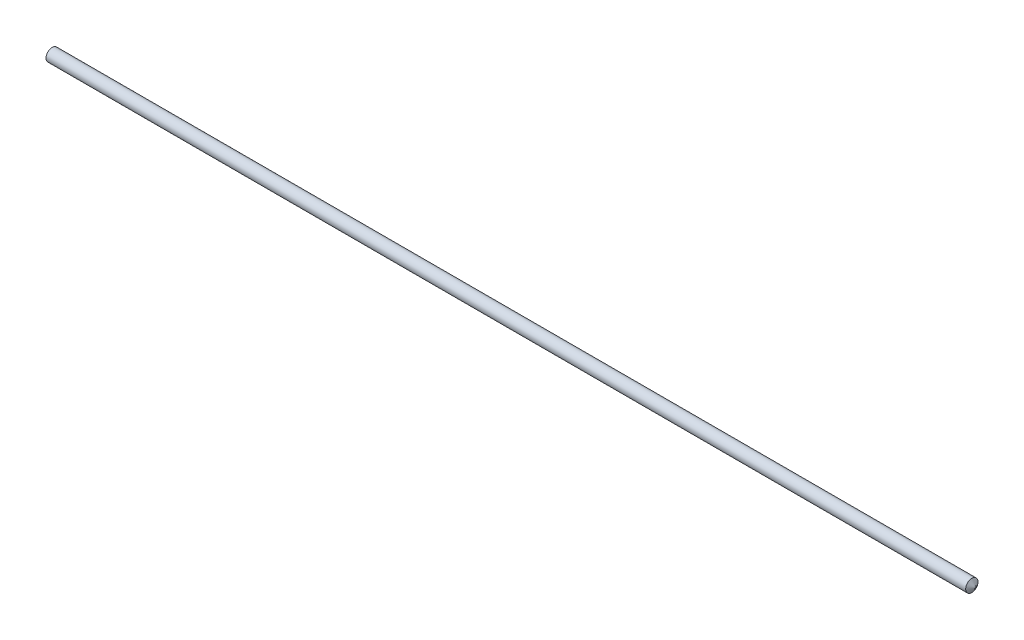
ISO-10303-21;
HEADER;
FILE_DESCRIPTION(('STEP AP214'),'2;1');
FILE_NAME('part.step','',(''),(''),'','','');
FILE_SCHEMA(('AUTOMOTIVE_DESIGN { 1 0 10303 214 1 1 1 1 }'));
ENDSEC;
DATA;
#1=APPLICATION_CONTEXT('core data for automotive mechanical design processes');
#2=APPLICATION_PROTOCOL_DEFINITION('international standard','automotive_design',2000,#1);
#3=PRODUCT_CONTEXT('',#1,'mechanical');
#4=PRODUCT('Part','Part','',(#3));
#5=PRODUCT_RELATED_PRODUCT_CATEGORY('part','',(#4));
#6=PRODUCT_DEFINITION_FORMATION('','',#4);
#7=PRODUCT_DEFINITION_CONTEXT('part definition',#1,'design');
#8=PRODUCT_DEFINITION('design','',#6,#7);
#9=PRODUCT_DEFINITION_SHAPE('','',#8);
#10=(LENGTH_UNIT() NAMED_UNIT(*) SI_UNIT(.MILLI.,.METRE.));
#11=(NAMED_UNIT(*) PLANE_ANGLE_UNIT() SI_UNIT($,.RADIAN.));
#12=(NAMED_UNIT(*) SI_UNIT($,.STERADIAN.) SOLID_ANGLE_UNIT());
#13=UNCERTAINTY_MEASURE_WITH_UNIT(LENGTH_MEASURE(1.E-05),#10,'distance_accuracy_value','');
#14=(GEOMETRIC_REPRESENTATION_CONTEXT(3) GLOBAL_UNCERTAINTY_ASSIGNED_CONTEXT((#13)) GLOBAL_UNIT_ASSIGNED_CONTEXT((#10,
#11,#12)) REPRESENTATION_CONTEXT('',''));
#15=CARTESIAN_POINT('',(0.,0.,0.));
#16=DIRECTION('',(0.,0.,1.));
#17=DIRECTION('',(1.,0.,0.));
#18=AXIS2_PLACEMENT_3D('',#15,#16,#17);
#19=CARTESIAN_POINT('',(0.600860619027557,0.,0.));
#20=DIRECTION('',(1.,0.,0.));
#21=DIRECTION('',(0.,0.,-1.));
#22=AXIS2_PLACEMENT_3D('',#19,#20,#21);
#23=CONICAL_SURFACE('',#22,1.,1.02974425867666);
#24=CARTESIAN_POINT('',(0.,0.,0.));
#25=VERTEX_POINT('',#24);
#26=VERTEX_LOOP('',#25);
#27=FACE_BOUND('',#26,.T.);
#28=CARTESIAN_POINT('',(0.600860619027557,0.,0.));
#29=DIRECTION('',(-1.,0.,0.));
#30=DIRECTION('',(0.,0.,1.));
#31=AXIS2_PLACEMENT_3D('',#28,#29,#30);
#32=CIRCLE('',#31,1.);
#33=CARTESIAN_POINT('',(0.600860619027557,0.,1.));
#34=VERTEX_POINT('',#33);
#35=EDGE_CURVE('E11',#34,#34,#32,.T.);
#36=ORIENTED_EDGE('',*,*,#35,.T.);
#37=EDGE_LOOP('',(#36));
#38=FACE_BOUND('',#37,.T.);
#39=ADVANCED_FACE('F33',(#27,#38),#23,.T.);
#40=CARTESIAN_POINT('',(0.,0.,0.));
#41=DIRECTION('',(-1.,0.,0.));
#42=DIRECTION('',(0.,0.,1.));
#43=AXIS2_PLACEMENT_3D('',#40,#41,#42);
#44=CYLINDRICAL_SURFACE('',#43,1.);
#45=ORIENTED_EDGE('',*,*,#35,.F.);
#46=EDGE_LOOP('',(#45));
#47=FACE_BOUND('',#46,.T.);
#48=CARTESIAN_POINT('',(149.399139380972,0.,0.));
#49=DIRECTION('',(-1.,0.,0.));
#50=DIRECTION('',(0.,0.,1.));
#51=AXIS2_PLACEMENT_3D('',#48,#49,#50);
#52=CIRCLE('',#51,1.);
#53=CARTESIAN_POINT('',(149.399139380972,0.,1.));
#54=VERTEX_POINT('',#53);
#55=EDGE_CURVE('E40',#54,#54,#52,.T.);
#56=ORIENTED_EDGE('',*,*,#55,.T.);
#57=EDGE_LOOP('',(#56));
#58=FACE_BOUND('',#57,.T.);
#59=ADVANCED_FACE('F48',(#47,#58),#44,.T.);
#60=CARTESIAN_POINT('',(150.,0.,0.));
#61=DIRECTION('',(-1.,0.,0.));
#62=DIRECTION('',(0.,0.,1.));
#63=AXIS2_PLACEMENT_3D('',#60,#61,#62);
#64=CONICAL_SURFACE('',#63,0.,1.02974425867665);
#65=ORIENTED_EDGE('',*,*,#55,.F.);
#66=EDGE_LOOP('',(#65));
#67=FACE_BOUND('',#66,.T.);
#68=CARTESIAN_POINT('',(150.,0.,0.));
#69=VERTEX_POINT('',#68);
#70=VERTEX_LOOP('',#69);
#71=FACE_BOUND('',#70,.T.);
#72=ADVANCED_FACE('F46',(#67,#71),#64,.T.);
#73=CLOSED_SHELL('',(#39,#59,#72));
#74=MANIFOLD_SOLID_BREP('B2',#73);
#75=ADVANCED_BREP_SHAPE_REPRESENTATION('',(#18,#74),#14);
#76=SHAPE_DEFINITION_REPRESENTATION(#9,#75);
ENDSEC;
END-ISO-10303-21;
